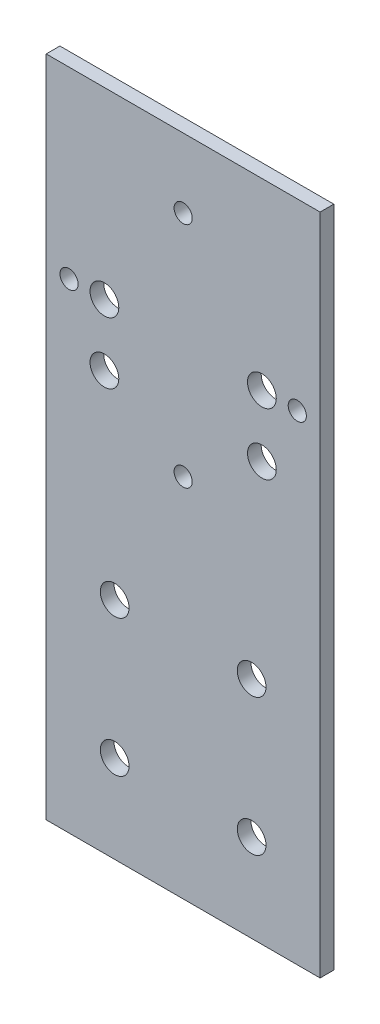
ISO-10303-21;
HEADER;
FILE_DESCRIPTION(('STEP AP214'),'2;1');
FILE_NAME('part.step','',(''),(''),'','','');
FILE_SCHEMA(('AUTOMOTIVE_DESIGN { 1 0 10303 214 1 1 1 1 }'));
ENDSEC;
DATA;
#1=APPLICATION_CONTEXT('core data for automotive mechanical design processes');
#2=APPLICATION_PROTOCOL_DEFINITION('international standard','automotive_design',2000,#1);
#3=PRODUCT_CONTEXT('',#1,'mechanical');
#4=PRODUCT('Part','Part','',(#3));
#5=PRODUCT_RELATED_PRODUCT_CATEGORY('part','',(#4));
#6=PRODUCT_DEFINITION_FORMATION('','',#4);
#7=PRODUCT_DEFINITION_CONTEXT('part definition',#1,'design');
#8=PRODUCT_DEFINITION('design','',#6,#7);
#9=PRODUCT_DEFINITION_SHAPE('','',#8);
#10=(LENGTH_UNIT() NAMED_UNIT(*) SI_UNIT(.MILLI.,.METRE.));
#11=(NAMED_UNIT(*) PLANE_ANGLE_UNIT() SI_UNIT($,.RADIAN.));
#12=(NAMED_UNIT(*) SI_UNIT($,.STERADIAN.) SOLID_ANGLE_UNIT());
#13=UNCERTAINTY_MEASURE_WITH_UNIT(LENGTH_MEASURE(1.E-05),#10,'distance_accuracy_value','');
#14=(GEOMETRIC_REPRESENTATION_CONTEXT(3) GLOBAL_UNCERTAINTY_ASSIGNED_CONTEXT((#13)) GLOBAL_UNIT_ASSIGNED_CONTEXT((#10,
#11,#12)) REPRESENTATION_CONTEXT('',''));
#15=CARTESIAN_POINT('',(0.,0.,0.));
#16=DIRECTION('',(0.,0.,1.));
#17=DIRECTION('',(1.,0.,0.));
#18=AXIS2_PLACEMENT_3D('',#15,#16,#17);
#19=CARTESIAN_POINT('',(1820.42117355047,-1907.58422740443,4.));
#20=DIRECTION('',(-1.,0.,0.));
#21=DIRECTION('',(0.,0.,1.));
#22=AXIS2_PLACEMENT_3D('',#19,#20,#21);
#23=PLANE('',#22);
#24=DIRECTION('',(0.,1.,0.));
#25=VECTOR('',#24,1.);
#26=CARTESIAN_POINT('',(1820.42117355047,-1907.58422740443,0.));
#27=LINE('',#26,#25);
#28=CARTESIAN_POINT('',(1820.42117355047,-1907.58422740443,0.));
#29=VERTEX_POINT('',#28);
#30=CARTESIAN_POINT('',(1820.42117355047,-1713.82818265565,0.));
#31=VERTEX_POINT('',#30);
#32=EDGE_CURVE('E96',#29,#31,#27,.T.);
#33=ORIENTED_EDGE('',*,*,#32,.T.);
#34=DIRECTION('',(0.,0.,-1.));
#35=VECTOR('',#34,1.);
#36=CARTESIAN_POINT('',(1820.42117355047,-1713.82818265565,4.));
#37=LINE('',#36,#35);
#38=CARTESIAN_POINT('',(1820.42117355047,-1713.82818265565,4.));
#39=VERTEX_POINT('',#38);
#40=EDGE_CURVE('E11',#39,#31,#37,.T.);
#41=ORIENTED_EDGE('',*,*,#40,.F.);
#42=DIRECTION('',(0.,1.,0.));
#43=VECTOR('',#42,1.);
#44=CARTESIAN_POINT('',(1820.42117355047,-1907.58422740443,4.));
#45=LINE('',#44,#43);
#46=CARTESIAN_POINT('',(1820.42117355047,-1907.58422740443,4.));
#47=VERTEX_POINT('',#46);
#48=EDGE_CURVE('E84',#47,#39,#45,.T.);
#49=ORIENTED_EDGE('',*,*,#48,.F.);
#50=DIRECTION('',(0.,0.,-1.));
#51=VECTOR('',#50,1.);
#52=CARTESIAN_POINT('',(1820.42117355047,-1907.58422740443,4.));
#53=LINE('',#52,#51);
#54=EDGE_CURVE('E92',#47,#29,#53,.T.);
#55=ORIENTED_EDGE('',*,*,#54,.T.);
#56=EDGE_LOOP('',(#33,#41,#49,#55));
#57=FACE_BOUND('',#56,.T.);
#58=ADVANCED_FACE('F33',(#57),#23,.F.);
#59=CARTESIAN_POINT('',(1820.42117355047,-1713.82818265565,4.));
#60=DIRECTION('',(0.,-1.,0.));
#61=DIRECTION('',(0.,0.,-1.));
#62=AXIS2_PLACEMENT_3D('',#59,#60,#61);
#63=PLANE('',#62);
#64=DIRECTION('',(-1.,0.,0.));
#65=VECTOR('',#64,1.);
#66=CARTESIAN_POINT('',(1820.42117355047,-1713.82818265565,0.));
#67=LINE('',#66,#65);
#68=CARTESIAN_POINT('',(1740.4211735505,-1713.82818265565,0.));
#69=VERTEX_POINT('',#68);
#70=EDGE_CURVE('E88',#31,#69,#67,.T.);
#71=ORIENTED_EDGE('',*,*,#70,.T.);
#72=DIRECTION('',(0.,0.,-1.));
#73=VECTOR('',#72,1.);
#74=CARTESIAN_POINT('',(1740.4211735505,-1713.82818265565,4.));
#75=LINE('',#74,#73);
#76=CARTESIAN_POINT('',(1740.4211735505,-1713.82818265565,4.));
#77=VERTEX_POINT('',#76);
#78=EDGE_CURVE('E41',#77,#69,#75,.T.);
#79=ORIENTED_EDGE('',*,*,#78,.F.);
#80=DIRECTION('',(-1.,0.,0.));
#81=VECTOR('',#80,1.);
#82=CARTESIAN_POINT('',(1820.42117355047,-1713.82818265565,4.));
#83=LINE('',#82,#81);
#84=EDGE_CURVE('E79',#39,#77,#83,.T.);
#85=ORIENTED_EDGE('',*,*,#84,.F.);
#86=ORIENTED_EDGE('',*,*,#40,.T.);
#87=EDGE_LOOP('',(#71,#79,#85,#86));
#88=FACE_BOUND('',#87,.T.);
#89=ADVANCED_FACE('F87',(#88),#63,.F.);
#90=CARTESIAN_POINT('',(1740.4211735505,-1907.58422740443,4.));
#91=DIRECTION('',(1.,0.,0.));
#92=DIRECTION('',(0.,0.,-1.));
#93=AXIS2_PLACEMENT_3D('',#90,#91,#92);
#94=PLANE('',#93);
#95=DIRECTION('',(0.,-1.,0.));
#96=VECTOR('',#95,1.);
#97=CARTESIAN_POINT('',(1740.4211735505,-1907.58422740443,0.));
#98=LINE('',#97,#96);
#99=CARTESIAN_POINT('',(1740.4211735505,-1907.58422740443,0.));
#100=VERTEX_POINT('',#99);
#101=EDGE_CURVE('E66',#69,#100,#98,.T.);
#102=ORIENTED_EDGE('',*,*,#101,.T.);
#103=DIRECTION('',(0.,0.,-1.));
#104=VECTOR('',#103,1.);
#105=CARTESIAN_POINT('',(1740.4211735505,-1907.58422740443,4.));
#106=LINE('',#105,#104);
#107=CARTESIAN_POINT('',(1740.4211735505,-1907.58422740443,4.));
#108=VERTEX_POINT('',#107);
#109=EDGE_CURVE('E89',#108,#100,#106,.T.);
#110=ORIENTED_EDGE('',*,*,#109,.F.);
#111=DIRECTION('',(0.,-1.,0.));
#112=VECTOR('',#111,1.);
#113=CARTESIAN_POINT('',(1740.4211735505,-1907.58422740443,4.));
#114=LINE('',#113,#112);
#115=EDGE_CURVE('E82',#77,#108,#114,.T.);
#116=ORIENTED_EDGE('',*,*,#115,.F.);
#117=ORIENTED_EDGE('',*,*,#78,.T.);
#118=EDGE_LOOP('',(#102,#110,#116,#117));
#119=FACE_BOUND('',#118,.T.);
#120=ADVANCED_FACE('F90',(#119),#94,.F.);
#121=CARTESIAN_POINT('',(1820.42117355047,-1907.58422740443,4.));
#122=DIRECTION('',(0.,1.,0.));
#123=DIRECTION('',(0.,0.,1.));
#124=AXIS2_PLACEMENT_3D('',#121,#122,#123);
#125=PLANE('',#124);
#126=DIRECTION('',(1.,0.,0.));
#127=VECTOR('',#126,1.);
#128=CARTESIAN_POINT('',(1820.42117355047,-1907.58422740443,0.));
#129=LINE('',#128,#127);
#130=EDGE_CURVE('E72',#100,#29,#129,.T.);
#131=ORIENTED_EDGE('',*,*,#130,.T.);
#132=ORIENTED_EDGE('',*,*,#54,.F.);
#133=DIRECTION('',(1.,0.,0.));
#134=VECTOR('',#133,1.);
#135=CARTESIAN_POINT('',(1820.42117355047,-1907.58422740443,4.));
#136=LINE('',#135,#134);
#137=EDGE_CURVE('E49',#108,#47,#136,.T.);
#138=ORIENTED_EDGE('',*,*,#137,.F.);
#139=ORIENTED_EDGE('',*,*,#109,.T.);
#140=EDGE_LOOP('',(#131,#132,#138,#139));
#141=FACE_BOUND('',#140,.T.);
#142=ADVANCED_FACE('F104',(#141),#125,.F.);
#143=CARTESIAN_POINT('',(0.,0.,4.));
#144=DIRECTION('',(0.,0.,1.));
#145=DIRECTION('',(1.,0.,0.));
#146=AXIS2_PLACEMENT_3D('',#143,#144,#145);
#147=PLANE('',#146);
#148=CARTESIAN_POINT('',(1813.75418721294,-1767.41940911596,4.));
#149=DIRECTION('',(0.,0.,1.));
#150=DIRECTION('',(1.,0.,0.));
#151=AXIS2_PLACEMENT_3D('',#148,#149,#150);
#152=CIRCLE('',#151,2.65000000000004);
#153=CARTESIAN_POINT('',(1816.40418721294,-1767.41940911596,4.));
#154=VERTEX_POINT('',#153);
#155=EDGE_CURVE('E178',#154,#154,#152,.T.);
#156=ORIENTED_EDGE('',*,*,#155,.F.);
#157=EDGE_LOOP('',(#156));
#158=FACE_BOUND('',#157,.T.);
#159=CARTESIAN_POINT('',(1747.08815988267,-1767.41940911596,4.));
#160=DIRECTION('',(0.,0.,1.));
#161=DIRECTION('',(1.,0.,0.));
#162=AXIS2_PLACEMENT_3D('',#159,#160,#161);
#163=CIRCLE('',#162,2.65000000000004);
#164=CARTESIAN_POINT('',(1749.73815988267,-1767.41940911596,4.));
#165=VERTEX_POINT('',#164);
#166=EDGE_CURVE('E172',#165,#165,#163,.T.);
#167=ORIENTED_EDGE('',*,*,#166,.F.);
#168=EDGE_LOOP('',(#167));
#169=FACE_BOUND('',#168,.T.);
#170=CARTESIAN_POINT('',(1780.42117354781,-1734.08639545083,4.));
#171=DIRECTION('',(0.,0.,1.));
#172=DIRECTION('',(1.,0.,0.));
#173=AXIS2_PLACEMENT_3D('',#170,#171,#172);
#174=CIRCLE('',#173,2.65000000000004);
#175=CARTESIAN_POINT('',(1783.07117354781,-1734.08639545083,4.));
#176=VERTEX_POINT('',#175);
#177=EDGE_CURVE('E166',#176,#176,#174,.T.);
#178=ORIENTED_EDGE('',*,*,#177,.F.);
#179=EDGE_LOOP('',(#178));
#180=FACE_BOUND('',#179,.T.);
#181=CARTESIAN_POINT('',(1780.42117354781,-1800.75242278109,4.));
#182=DIRECTION('',(0.,0.,1.));
#183=DIRECTION('',(1.,0.,0.));
#184=AXIS2_PLACEMENT_3D('',#181,#182,#183);
#185=CIRCLE('',#184,2.65000000000004);
#186=CARTESIAN_POINT('',(1783.07117354781,-1800.75242278109,4.));
#187=VERTEX_POINT('',#186);
#188=EDGE_CURVE('E160',#187,#187,#185,.T.);
#189=ORIENTED_EDGE('',*,*,#188,.F.);
#190=EDGE_LOOP('',(#189));
#191=FACE_BOUND('',#190,.T.);
#192=CARTESIAN_POINT('',(1757.42117354781,-1767.41940911596,4.));
#193=DIRECTION('',(0.,0.,1.));
#194=DIRECTION('',(1.,0.,0.));
#195=AXIS2_PLACEMENT_3D('',#192,#193,#194);
#196=CIRCLE('',#195,4.19999999999998);
#197=CARTESIAN_POINT('',(1761.62117354781,-1767.41940911596,4.));
#198=VERTEX_POINT('',#197);
#199=EDGE_CURVE('E154',#198,#198,#196,.T.);
#200=ORIENTED_EDGE('',*,*,#199,.F.);
#201=EDGE_LOOP('',(#200));
#202=FACE_BOUND('',#201,.T.);
#203=CARTESIAN_POINT('',(1803.42117354781,-1767.41940911596,4.));
#204=DIRECTION('',(0.,0.,1.));
#205=DIRECTION('',(1.,0.,0.));
#206=AXIS2_PLACEMENT_3D('',#203,#204,#205);
#207=CIRCLE('',#206,4.19999999999998);
#208=CARTESIAN_POINT('',(1807.62117354781,-1767.41940911596,4.));
#209=VERTEX_POINT('',#208);
#210=EDGE_CURVE('E148',#209,#209,#207,.T.);
#211=ORIENTED_EDGE('',*,*,#210,.F.);
#212=EDGE_LOOP('',(#211));
#213=FACE_BOUND('',#212,.T.);
#214=CARTESIAN_POINT('',(1803.42117354781,-1785.41940911596,4.));
#215=DIRECTION('',(0.,0.,1.));
#216=DIRECTION('',(1.,0.,0.));
#217=AXIS2_PLACEMENT_3D('',#214,#215,#216);
#218=CIRCLE('',#217,4.19999999999998);
#219=CARTESIAN_POINT('',(1807.62117354781,-1785.41940911596,4.));
#220=VERTEX_POINT('',#219);
#221=EDGE_CURVE('E142',#220,#220,#218,.T.);
#222=ORIENTED_EDGE('',*,*,#221,.F.);
#223=EDGE_LOOP('',(#222));
#224=FACE_BOUND('',#223,.T.);
#225=CARTESIAN_POINT('',(1757.42117354781,-1785.41940911596,4.));
#226=DIRECTION('',(0.,0.,1.));
#227=DIRECTION('',(1.,0.,0.));
#228=AXIS2_PLACEMENT_3D('',#225,#226,#227);
#229=CIRCLE('',#228,4.19999999999998);
#230=CARTESIAN_POINT('',(1761.62117354781,-1785.41940911596,4.));
#231=VERTEX_POINT('',#230);
#232=EDGE_CURVE('E136',#231,#231,#229,.T.);
#233=ORIENTED_EDGE('',*,*,#232,.F.);
#234=EDGE_LOOP('',(#233));
#235=FACE_BOUND('',#234,.T.);
#236=CARTESIAN_POINT('',(1800.4211735505,-1841.91940911595,4.));
#237=DIRECTION('',(0.,0.,1.));
#238=DIRECTION('',(1.,0.,0.));
#239=AXIS2_PLACEMENT_3D('',#236,#237,#238);
#240=CIRCLE('',#239,4.19999999999998);
#241=CARTESIAN_POINT('',(1804.6211735505,-1841.91940911595,4.));
#242=VERTEX_POINT('',#241);
#243=EDGE_CURVE('E130',#242,#242,#240,.T.);
#244=ORIENTED_EDGE('',*,*,#243,.F.);
#245=EDGE_LOOP('',(#244));
#246=FACE_BOUND('',#245,.T.);
#247=CARTESIAN_POINT('',(1760.4211735505,-1841.91940911595,4.));
#248=DIRECTION('',(0.,0.,1.));
#249=DIRECTION('',(1.,0.,0.));
#250=AXIS2_PLACEMENT_3D('',#247,#248,#249);
#251=CIRCLE('',#250,4.19999999999998);
#252=CARTESIAN_POINT('',(1764.6211735505,-1841.91940911595,4.));
#253=VERTEX_POINT('',#252);
#254=EDGE_CURVE('E124',#253,#253,#251,.T.);
#255=ORIENTED_EDGE('',*,*,#254,.F.);
#256=EDGE_LOOP('',(#255));
#257=FACE_BOUND('',#256,.T.);
#258=CARTESIAN_POINT('',(1800.4211735505,-1881.91940911595,4.));
#259=DIRECTION('',(0.,0.,1.));
#260=DIRECTION('',(1.,0.,0.));
#261=AXIS2_PLACEMENT_3D('',#258,#259,#260);
#262=CIRCLE('',#261,4.19999999999998);
#263=CARTESIAN_POINT('',(1804.6211735505,-1881.91940911595,4.));
#264=VERTEX_POINT('',#263);
#265=EDGE_CURVE('E118',#264,#264,#262,.T.);
#266=ORIENTED_EDGE('',*,*,#265,.F.);
#267=EDGE_LOOP('',(#266));
#268=FACE_BOUND('',#267,.T.);
#269=CARTESIAN_POINT('',(1760.4211735505,-1881.91940911595,4.));
#270=DIRECTION('',(0.,0.,1.));
#271=DIRECTION('',(1.,0.,0.));
#272=AXIS2_PLACEMENT_3D('',#269,#270,#271);
#273=CIRCLE('',#272,4.19999999999998);
#274=CARTESIAN_POINT('',(1764.6211735505,-1881.91940911595,4.));
#275=VERTEX_POINT('',#274);
#276=EDGE_CURVE('E112',#275,#275,#273,.T.);
#277=ORIENTED_EDGE('',*,*,#276,.F.);
#278=EDGE_LOOP('',(#277));
#279=FACE_BOUND('',#278,.T.);
#280=ORIENTED_EDGE('',*,*,#48,.T.);
#281=ORIENTED_EDGE('',*,*,#84,.T.);
#282=ORIENTED_EDGE('',*,*,#115,.T.);
#283=ORIENTED_EDGE('',*,*,#137,.T.);
#284=EDGE_LOOP('',(#280,#281,#282,#283));
#285=FACE_BOUND('',#284,.T.);
#286=ADVANCED_FACE('F80',(#158,#169,#180,#191,#202,#213,#224,#235,#246,#257,#268,#279,#285),
#147,.T.);
#287=CARTESIAN_POINT('',(0.,0.,0.));
#288=DIRECTION('',(0.,0.,1.));
#289=DIRECTION('',(1.,0.,0.));
#290=AXIS2_PLACEMENT_3D('',#287,#288,#289);
#291=PLANE('',#290);
#292=CARTESIAN_POINT('',(1813.75418721294,-1767.41940911596,0.));
#293=DIRECTION('',(0.,0.,1.));
#294=DIRECTION('',(1.,0.,0.));
#295=AXIS2_PLACEMENT_3D('',#292,#293,#294);
#296=CIRCLE('',#295,2.65000000000004);
#297=CARTESIAN_POINT('',(1816.40418721294,-1767.41940911596,0.));
#298=VERTEX_POINT('',#297);
#299=EDGE_CURVE('E175',#298,#298,#296,.T.);
#300=ORIENTED_EDGE('',*,*,#299,.T.);
#301=EDGE_LOOP('',(#300));
#302=FACE_BOUND('',#301,.T.);
#303=CARTESIAN_POINT('',(1747.08815988267,-1767.41940911596,0.));
#304=DIRECTION('',(0.,0.,1.));
#305=DIRECTION('',(1.,0.,0.));
#306=AXIS2_PLACEMENT_3D('',#303,#304,#305);
#307=CIRCLE('',#306,2.65000000000004);
#308=CARTESIAN_POINT('',(1749.73815988267,-1767.41940911596,0.));
#309=VERTEX_POINT('',#308);
#310=EDGE_CURVE('E169',#309,#309,#307,.T.);
#311=ORIENTED_EDGE('',*,*,#310,.T.);
#312=EDGE_LOOP('',(#311));
#313=FACE_BOUND('',#312,.T.);
#314=CARTESIAN_POINT('',(1780.42117354781,-1734.08639545083,0.));
#315=DIRECTION('',(0.,0.,1.));
#316=DIRECTION('',(1.,0.,0.));
#317=AXIS2_PLACEMENT_3D('',#314,#315,#316);
#318=CIRCLE('',#317,2.65000000000004);
#319=CARTESIAN_POINT('',(1783.07117354781,-1734.08639545083,0.));
#320=VERTEX_POINT('',#319);
#321=EDGE_CURVE('E163',#320,#320,#318,.T.);
#322=ORIENTED_EDGE('',*,*,#321,.T.);
#323=EDGE_LOOP('',(#322));
#324=FACE_BOUND('',#323,.T.);
#325=CARTESIAN_POINT('',(1780.42117354781,-1800.75242278109,0.));
#326=DIRECTION('',(0.,0.,1.));
#327=DIRECTION('',(1.,0.,0.));
#328=AXIS2_PLACEMENT_3D('',#325,#326,#327);
#329=CIRCLE('',#328,2.65000000000004);
#330=CARTESIAN_POINT('',(1783.07117354781,-1800.75242278109,0.));
#331=VERTEX_POINT('',#330);
#332=EDGE_CURVE('E157',#331,#331,#329,.T.);
#333=ORIENTED_EDGE('',*,*,#332,.T.);
#334=EDGE_LOOP('',(#333));
#335=FACE_BOUND('',#334,.T.);
#336=CARTESIAN_POINT('',(1757.42117354781,-1767.41940911596,0.));
#337=DIRECTION('',(0.,0.,1.));
#338=DIRECTION('',(1.,0.,0.));
#339=AXIS2_PLACEMENT_3D('',#336,#337,#338);
#340=CIRCLE('',#339,4.19999999999998);
#341=CARTESIAN_POINT('',(1761.62117354781,-1767.41940911596,0.));
#342=VERTEX_POINT('',#341);
#343=EDGE_CURVE('E151',#342,#342,#340,.T.);
#344=ORIENTED_EDGE('',*,*,#343,.T.);
#345=EDGE_LOOP('',(#344));
#346=FACE_BOUND('',#345,.T.);
#347=CARTESIAN_POINT('',(1803.42117354781,-1767.41940911596,0.));
#348=DIRECTION('',(0.,0.,1.));
#349=DIRECTION('',(1.,0.,0.));
#350=AXIS2_PLACEMENT_3D('',#347,#348,#349);
#351=CIRCLE('',#350,4.19999999999998);
#352=CARTESIAN_POINT('',(1807.62117354781,-1767.41940911596,0.));
#353=VERTEX_POINT('',#352);
#354=EDGE_CURVE('E145',#353,#353,#351,.T.);
#355=ORIENTED_EDGE('',*,*,#354,.T.);
#356=EDGE_LOOP('',(#355));
#357=FACE_BOUND('',#356,.T.);
#358=CARTESIAN_POINT('',(1803.42117354781,-1785.41940911596,0.));
#359=DIRECTION('',(0.,0.,1.));
#360=DIRECTION('',(1.,0.,0.));
#361=AXIS2_PLACEMENT_3D('',#358,#359,#360);
#362=CIRCLE('',#361,4.19999999999998);
#363=CARTESIAN_POINT('',(1807.62117354781,-1785.41940911596,0.));
#364=VERTEX_POINT('',#363);
#365=EDGE_CURVE('E139',#364,#364,#362,.T.);
#366=ORIENTED_EDGE('',*,*,#365,.T.);
#367=EDGE_LOOP('',(#366));
#368=FACE_BOUND('',#367,.T.);
#369=CARTESIAN_POINT('',(1757.42117354781,-1785.41940911596,0.));
#370=DIRECTION('',(0.,0.,1.));
#371=DIRECTION('',(1.,0.,0.));
#372=AXIS2_PLACEMENT_3D('',#369,#370,#371);
#373=CIRCLE('',#372,4.19999999999998);
#374=CARTESIAN_POINT('',(1761.62117354781,-1785.41940911596,0.));
#375=VERTEX_POINT('',#374);
#376=EDGE_CURVE('E133',#375,#375,#373,.T.);
#377=ORIENTED_EDGE('',*,*,#376,.T.);
#378=EDGE_LOOP('',(#377));
#379=FACE_BOUND('',#378,.T.);
#380=CARTESIAN_POINT('',(1800.4211735505,-1841.91940911595,0.));
#381=DIRECTION('',(0.,0.,1.));
#382=DIRECTION('',(1.,0.,0.));
#383=AXIS2_PLACEMENT_3D('',#380,#381,#382);
#384=CIRCLE('',#383,4.19999999999998);
#385=CARTESIAN_POINT('',(1804.6211735505,-1841.91940911595,0.));
#386=VERTEX_POINT('',#385);
#387=EDGE_CURVE('E127',#386,#386,#384,.T.);
#388=ORIENTED_EDGE('',*,*,#387,.T.);
#389=EDGE_LOOP('',(#388));
#390=FACE_BOUND('',#389,.T.);
#391=CARTESIAN_POINT('',(1760.4211735505,-1841.91940911595,0.));
#392=DIRECTION('',(0.,0.,1.));
#393=DIRECTION('',(1.,0.,0.));
#394=AXIS2_PLACEMENT_3D('',#391,#392,#393);
#395=CIRCLE('',#394,4.19999999999998);
#396=CARTESIAN_POINT('',(1764.6211735505,-1841.91940911595,0.));
#397=VERTEX_POINT('',#396);
#398=EDGE_CURVE('E121',#397,#397,#395,.T.);
#399=ORIENTED_EDGE('',*,*,#398,.T.);
#400=EDGE_LOOP('',(#399));
#401=FACE_BOUND('',#400,.T.);
#402=CARTESIAN_POINT('',(1800.4211735505,-1881.91940911595,0.));
#403=DIRECTION('',(0.,0.,1.));
#404=DIRECTION('',(1.,0.,0.));
#405=AXIS2_PLACEMENT_3D('',#402,#403,#404);
#406=CIRCLE('',#405,4.19999999999998);
#407=CARTESIAN_POINT('',(1804.6211735505,-1881.91940911595,0.));
#408=VERTEX_POINT('',#407);
#409=EDGE_CURVE('E115',#408,#408,#406,.T.);
#410=ORIENTED_EDGE('',*,*,#409,.T.);
#411=EDGE_LOOP('',(#410));
#412=FACE_BOUND('',#411,.T.);
#413=CARTESIAN_POINT('',(1760.4211735505,-1881.91940911595,0.));
#414=DIRECTION('',(0.,0.,1.));
#415=DIRECTION('',(1.,0.,0.));
#416=AXIS2_PLACEMENT_3D('',#413,#414,#415);
#417=CIRCLE('',#416,4.19999999999998);
#418=CARTESIAN_POINT('',(1764.6211735505,-1881.91940911595,0.));
#419=VERTEX_POINT('',#418);
#420=EDGE_CURVE('E99',#419,#419,#417,.T.);
#421=ORIENTED_EDGE('',*,*,#420,.T.);
#422=EDGE_LOOP('',(#421));
#423=FACE_BOUND('',#422,.T.);
#424=ORIENTED_EDGE('',*,*,#32,.F.);
#425=ORIENTED_EDGE('',*,*,#130,.F.);
#426=ORIENTED_EDGE('',*,*,#101,.F.);
#427=ORIENTED_EDGE('',*,*,#70,.F.);
#428=EDGE_LOOP('',(#424,#425,#426,#427));
#429=FACE_BOUND('',#428,.T.);
#430=ADVANCED_FACE('F107',(#302,#313,#324,#335,#346,#357,#368,#379,#390,#401,#412,#423,#429),
#291,.F.);
#431=CARTESIAN_POINT('',(1760.4211735505,-1881.91940911595,4.));
#432=DIRECTION('',(0.,0.,1.));
#433=DIRECTION('',(1.,0.,0.));
#434=AXIS2_PLACEMENT_3D('',#431,#432,#433);
#435=CYLINDRICAL_SURFACE('',#434,4.19999999999998);
#436=ORIENTED_EDGE('',*,*,#420,.F.);
#437=EDGE_LOOP('',(#436));
#438=FACE_BOUND('',#437,.T.);
#439=ORIENTED_EDGE('',*,*,#276,.T.);
#440=EDGE_LOOP('',(#439));
#441=FACE_BOUND('',#440,.T.);
#442=ADVANCED_FACE('F209',(#438,#441),#435,.F.);
#443=CARTESIAN_POINT('',(1800.4211735505,-1881.91940911595,4.));
#444=DIRECTION('',(0.,0.,1.));
#445=DIRECTION('',(1.,0.,0.));
#446=AXIS2_PLACEMENT_3D('',#443,#444,#445);
#447=CYLINDRICAL_SURFACE('',#446,4.19999999999998);
#448=ORIENTED_EDGE('',*,*,#409,.F.);
#449=EDGE_LOOP('',(#448));
#450=FACE_BOUND('',#449,.T.);
#451=ORIENTED_EDGE('',*,*,#265,.T.);
#452=EDGE_LOOP('',(#451));
#453=FACE_BOUND('',#452,.T.);
#454=ADVANCED_FACE('F211',(#450,#453),#447,.F.);
#455=CARTESIAN_POINT('',(1760.4211735505,-1841.91940911595,4.));
#456=DIRECTION('',(0.,0.,1.));
#457=DIRECTION('',(1.,0.,0.));
#458=AXIS2_PLACEMENT_3D('',#455,#456,#457);
#459=CYLINDRICAL_SURFACE('',#458,4.19999999999998);
#460=ORIENTED_EDGE('',*,*,#398,.F.);
#461=EDGE_LOOP('',(#460));
#462=FACE_BOUND('',#461,.T.);
#463=ORIENTED_EDGE('',*,*,#254,.T.);
#464=EDGE_LOOP('',(#463));
#465=FACE_BOUND('',#464,.T.);
#466=ADVANCED_FACE('F218',(#462,#465),#459,.F.);
#467=CARTESIAN_POINT('',(1800.4211735505,-1841.91940911595,4.));
#468=DIRECTION('',(0.,0.,1.));
#469=DIRECTION('',(1.,0.,0.));
#470=AXIS2_PLACEMENT_3D('',#467,#468,#469);
#471=CYLINDRICAL_SURFACE('',#470,4.19999999999998);
#472=ORIENTED_EDGE('',*,*,#387,.F.);
#473=EDGE_LOOP('',(#472));
#474=FACE_BOUND('',#473,.T.);
#475=ORIENTED_EDGE('',*,*,#243,.T.);
#476=EDGE_LOOP('',(#475));
#477=FACE_BOUND('',#476,.T.);
#478=ADVANCED_FACE('F309',(#474,#477),#471,.F.);
#479=CARTESIAN_POINT('',(1757.42117354781,-1785.41940911596,4.));
#480=DIRECTION('',(0.,0.,1.));
#481=DIRECTION('',(1.,0.,0.));
#482=AXIS2_PLACEMENT_3D('',#479,#480,#481);
#483=CYLINDRICAL_SURFACE('',#482,4.19999999999998);
#484=ORIENTED_EDGE('',*,*,#376,.F.);
#485=EDGE_LOOP('',(#484));
#486=FACE_BOUND('',#485,.T.);
#487=ORIENTED_EDGE('',*,*,#232,.T.);
#488=EDGE_LOOP('',(#487));
#489=FACE_BOUND('',#488,.T.);
#490=ADVANCED_FACE('F305',(#486,#489),#483,.F.);
#491=CARTESIAN_POINT('',(1803.42117354781,-1785.41940911596,4.));
#492=DIRECTION('',(0.,0.,1.));
#493=DIRECTION('',(1.,0.,0.));
#494=AXIS2_PLACEMENT_3D('',#491,#492,#493);
#495=CYLINDRICAL_SURFACE('',#494,4.19999999999998);
#496=ORIENTED_EDGE('',*,*,#365,.F.);
#497=EDGE_LOOP('',(#496));
#498=FACE_BOUND('',#497,.T.);
#499=ORIENTED_EDGE('',*,*,#221,.T.);
#500=EDGE_LOOP('',(#499));
#501=FACE_BOUND('',#500,.T.);
#502=ADVANCED_FACE('F301',(#498,#501),#495,.F.);
#503=CARTESIAN_POINT('',(1803.42117354781,-1767.41940911596,4.));
#504=DIRECTION('',(0.,0.,1.));
#505=DIRECTION('',(1.,0.,0.));
#506=AXIS2_PLACEMENT_3D('',#503,#504,#505);
#507=CYLINDRICAL_SURFACE('',#506,4.19999999999998);
#508=ORIENTED_EDGE('',*,*,#354,.F.);
#509=EDGE_LOOP('',(#508));
#510=FACE_BOUND('',#509,.T.);
#511=ORIENTED_EDGE('',*,*,#210,.T.);
#512=EDGE_LOOP('',(#511));
#513=FACE_BOUND('',#512,.T.);
#514=ADVANCED_FACE('F297',(#510,#513),#507,.F.);
#515=CARTESIAN_POINT('',(1757.42117354781,-1767.41940911596,4.));
#516=DIRECTION('',(0.,0.,1.));
#517=DIRECTION('',(1.,0.,0.));
#518=AXIS2_PLACEMENT_3D('',#515,#516,#517);
#519=CYLINDRICAL_SURFACE('',#518,4.19999999999998);
#520=ORIENTED_EDGE('',*,*,#343,.F.);
#521=EDGE_LOOP('',(#520));
#522=FACE_BOUND('',#521,.T.);
#523=ORIENTED_EDGE('',*,*,#199,.T.);
#524=EDGE_LOOP('',(#523));
#525=FACE_BOUND('',#524,.T.);
#526=ADVANCED_FACE('F259',(#522,#525),#519,.F.);
#527=CARTESIAN_POINT('',(1780.42117354781,-1800.75242278109,4.));
#528=DIRECTION('',(0.,0.,1.));
#529=DIRECTION('',(1.,0.,0.));
#530=AXIS2_PLACEMENT_3D('',#527,#528,#529);
#531=CYLINDRICAL_SURFACE('',#530,2.65000000000004);
#532=ORIENTED_EDGE('',*,*,#332,.F.);
#533=EDGE_LOOP('',(#532));
#534=FACE_BOUND('',#533,.T.);
#535=ORIENTED_EDGE('',*,*,#188,.T.);
#536=EDGE_LOOP('',(#535));
#537=FACE_BOUND('',#536,.T.);
#538=ADVANCED_FACE('F253',(#534,#537),#531,.F.);
#539=CARTESIAN_POINT('',(1780.42117354781,-1734.08639545083,4.));
#540=DIRECTION('',(0.,0.,1.));
#541=DIRECTION('',(1.,0.,0.));
#542=AXIS2_PLACEMENT_3D('',#539,#540,#541);
#543=CYLINDRICAL_SURFACE('',#542,2.65000000000004);
#544=ORIENTED_EDGE('',*,*,#321,.F.);
#545=EDGE_LOOP('',(#544));
#546=FACE_BOUND('',#545,.T.);
#547=ORIENTED_EDGE('',*,*,#177,.T.);
#548=EDGE_LOOP('',(#547));
#549=FACE_BOUND('',#548,.T.);
#550=ADVANCED_FACE('F258',(#546,#549),#543,.F.);
#551=CARTESIAN_POINT('',(1747.08815988267,-1767.41940911596,4.));
#552=DIRECTION('',(0.,0.,1.));
#553=DIRECTION('',(1.,0.,0.));
#554=AXIS2_PLACEMENT_3D('',#551,#552,#553);
#555=CYLINDRICAL_SURFACE('',#554,2.65000000000004);
#556=ORIENTED_EDGE('',*,*,#310,.F.);
#557=EDGE_LOOP('',(#556));
#558=FACE_BOUND('',#557,.T.);
#559=ORIENTED_EDGE('',*,*,#166,.T.);
#560=EDGE_LOOP('',(#559));
#561=FACE_BOUND('',#560,.T.);
#562=ADVANCED_FACE('F271',(#558,#561),#555,.F.);
#563=CARTESIAN_POINT('',(1813.75418721294,-1767.41940911596,4.));
#564=DIRECTION('',(0.,0.,1.));
#565=DIRECTION('',(1.,0.,0.));
#566=AXIS2_PLACEMENT_3D('',#563,#564,#565);
#567=CYLINDRICAL_SURFACE('',#566,2.65000000000004);
#568=ORIENTED_EDGE('',*,*,#299,.F.);
#569=EDGE_LOOP('',(#568));
#570=FACE_BOUND('',#569,.T.);
#571=ORIENTED_EDGE('',*,*,#155,.T.);
#572=EDGE_LOOP('',(#571));
#573=FACE_BOUND('',#572,.T.);
#574=ADVANCED_FACE('F182',(#570,#573),#567,.F.);
#575=CLOSED_SHELL('',(#58,#89,#120,#142,#286,#430,#442,#454,#466,#478,#490,#502,#514,#526,#538,
#550,#562,#574));
#576=MANIFOLD_SOLID_BREP('B2',#575);
#577=ADVANCED_BREP_SHAPE_REPRESENTATION('',(#18,#576),#14);
#578=SHAPE_DEFINITION_REPRESENTATION(#9,#577);
ENDSEC;
END-ISO-10303-21;
